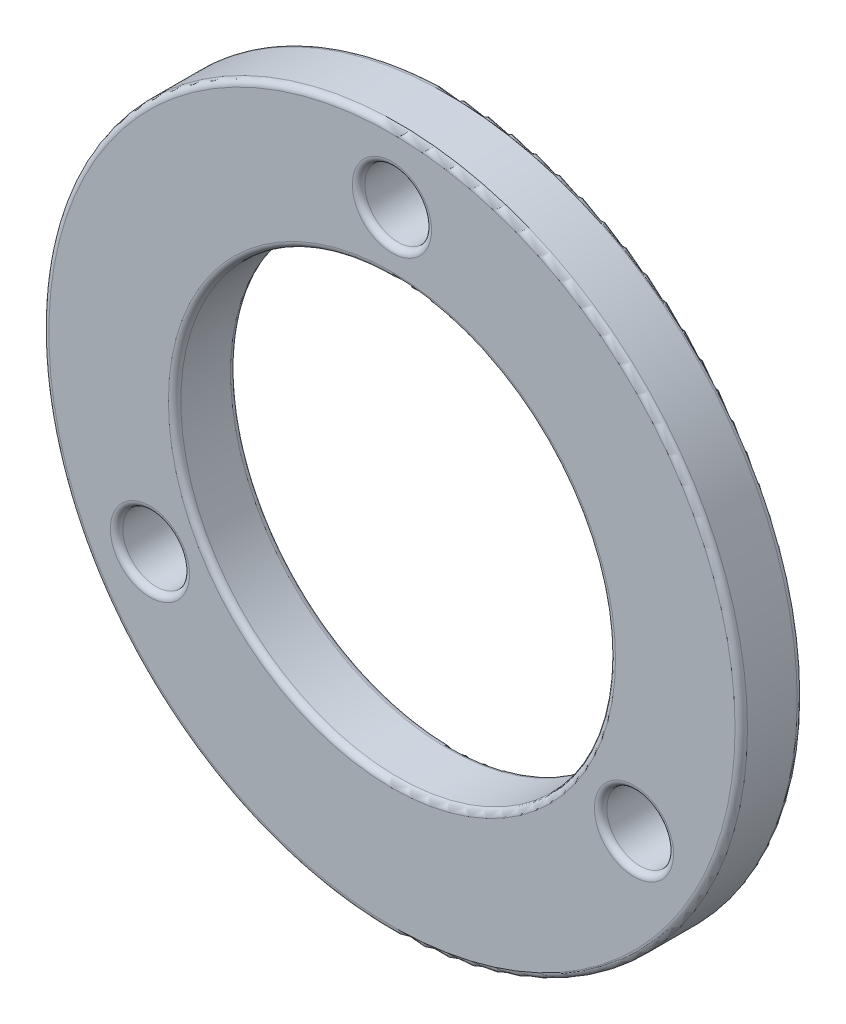
ISO-10303-21;
HEADER;
FILE_DESCRIPTION(('STEP AP214'),'2;1');
FILE_NAME('part.step','',(''),(''),'','','');
FILE_SCHEMA(('AUTOMOTIVE_DESIGN { 1 0 10303 214 1 1 1 1 }'));
ENDSEC;
DATA;
#1=APPLICATION_CONTEXT('core data for automotive mechanical design processes');
#2=APPLICATION_PROTOCOL_DEFINITION('international standard','automotive_design',2000,#1);
#3=PRODUCT_CONTEXT('',#1,'mechanical');
#4=PRODUCT('Part','Part','',(#3));
#5=PRODUCT_RELATED_PRODUCT_CATEGORY('part','',(#4));
#6=PRODUCT_DEFINITION_FORMATION('','',#4);
#7=PRODUCT_DEFINITION_CONTEXT('part definition',#1,'design');
#8=PRODUCT_DEFINITION('design','',#6,#7);
#9=PRODUCT_DEFINITION_SHAPE('','',#8);
#10=(LENGTH_UNIT() NAMED_UNIT(*) SI_UNIT(.MILLI.,.METRE.));
#11=(NAMED_UNIT(*) PLANE_ANGLE_UNIT() SI_UNIT($,.RADIAN.));
#12=(NAMED_UNIT(*) SI_UNIT($,.STERADIAN.) SOLID_ANGLE_UNIT());
#13=UNCERTAINTY_MEASURE_WITH_UNIT(LENGTH_MEASURE(1.E-05),#10,'distance_accuracy_value','');
#14=(GEOMETRIC_REPRESENTATION_CONTEXT(3) GLOBAL_UNCERTAINTY_ASSIGNED_CONTEXT((#13)) GLOBAL_UNIT_ASSIGNED_CONTEXT((#10,
#11,#12)) REPRESENTATION_CONTEXT('',''));
#15=CARTESIAN_POINT('',(0.,0.,0.));
#16=DIRECTION('',(0.,0.,1.));
#17=DIRECTION('',(1.,0.,0.));
#18=AXIS2_PLACEMENT_3D('',#15,#16,#17);
#19=CARTESIAN_POINT('',(0.,0.,20.));
#20=DIRECTION('',(0.,0.,1.));
#21=DIRECTION('',(1.,0.,0.));
#22=AXIS2_PLACEMENT_3D('',#19,#20,#21);
#23=PLANE('',#22);
#24=CARTESIAN_POINT('',(0.,0.,20.));
#25=DIRECTION('',(0.,0.,1.));
#26=DIRECTION('',(1.,0.,0.));
#27=AXIS2_PLACEMENT_3D('',#24,#25,#26);
#28=CIRCLE('',#27,72.);
#29=CARTESIAN_POINT('',(72.,0.,20.));
#30=VERTEX_POINT('',#29);
#31=EDGE_CURVE('E75',#30,#30,#28,.F.);
#32=ORIENTED_EDGE('',*,*,#31,.T.);
#33=EDGE_LOOP('',(#32));
#34=FACE_BOUND('',#33,.T.);
#35=CARTESIAN_POINT('',(0.,0.,20.));
#36=DIRECTION('',(0.,0.,1.));
#37=DIRECTION('',(1.,0.,0.));
#38=AXIS2_PLACEMENT_3D('',#35,#36,#37);
#39=CIRCLE('',#38,110.5);
#40=CARTESIAN_POINT('',(110.5,0.,20.));
#41=VERTEX_POINT('',#40);
#42=EDGE_CURVE('E78',#41,#41,#39,.T.);
#43=ORIENTED_EDGE('',*,*,#42,.T.);
#44=EDGE_LOOP('',(#43));
#45=FACE_BOUND('',#44,.T.);
#46=CARTESIAN_POINT('',(-77.9422863405995,-45.,20.));
#47=DIRECTION('',(0.,0.,1.));
#48=DIRECTION('',(1.,0.,0.));
#49=AXIS2_PLACEMENT_3D('',#46,#47,#48);
#50=CIRCLE('',#49,12.75);
#51=CARTESIAN_POINT('',(-65.1922863405995,-45.,20.));
#52=VERTEX_POINT('',#51);
#53=EDGE_CURVE('E81',#52,#52,#50,.F.);
#54=ORIENTED_EDGE('',*,*,#53,.T.);
#55=EDGE_LOOP('',(#54));
#56=FACE_BOUND('',#55,.T.);
#57=CARTESIAN_POINT('',(0.,90.,20.));
#58=DIRECTION('',(0.,0.,1.));
#59=DIRECTION('',(1.,0.,0.));
#60=AXIS2_PLACEMENT_3D('',#57,#58,#59);
#61=CIRCLE('',#60,12.75);
#62=CARTESIAN_POINT('',(12.75,90.,20.));
#63=VERTEX_POINT('',#62);
#64=EDGE_CURVE('E84',#63,#63,#61,.F.);
#65=ORIENTED_EDGE('',*,*,#64,.T.);
#66=EDGE_LOOP('',(#65));
#67=FACE_BOUND('',#66,.T.);
#68=CARTESIAN_POINT('',(77.9422863405995,-45.,20.));
#69=DIRECTION('',(0.,0.,1.));
#70=DIRECTION('',(1.,0.,0.));
#71=AXIS2_PLACEMENT_3D('',#68,#69,#70);
#72=CIRCLE('',#71,12.75);
#73=CARTESIAN_POINT('',(90.6922863405995,-45.,20.));
#74=VERTEX_POINT('',#73);
#75=EDGE_CURVE('E87',#74,#74,#72,.F.);
#76=ORIENTED_EDGE('',*,*,#75,.T.);
#77=EDGE_LOOP('',(#76));
#78=FACE_BOUND('',#77,.T.);
#79=ADVANCED_FACE('F49',(#34,#45,#56,#67,#78),#23,.T.);
#80=CARTESIAN_POINT('',(0.,0.,0.));
#81=DIRECTION('',(0.,0.,1.));
#82=DIRECTION('',(1.,0.,0.));
#83=AXIS2_PLACEMENT_3D('',#80,#81,#82);
#84=PLANE('',#83);
#85=CARTESIAN_POINT('',(0.,0.,0.));
#86=DIRECTION('',(0.,0.,1.));
#87=DIRECTION('',(1.,0.,0.));
#88=AXIS2_PLACEMENT_3D('',#85,#86,#87);
#89=CIRCLE('',#88,72.);
#90=CARTESIAN_POINT('',(72.,0.,0.));
#91=VERTEX_POINT('',#90);
#92=EDGE_CURVE('E102',#91,#91,#89,.T.);
#93=ORIENTED_EDGE('',*,*,#92,.T.);
#94=EDGE_LOOP('',(#93));
#95=FACE_BOUND('',#94,.T.);
#96=CARTESIAN_POINT('',(0.,0.,0.));
#97=DIRECTION('',(0.,0.,1.));
#98=DIRECTION('',(1.,0.,0.));
#99=AXIS2_PLACEMENT_3D('',#96,#97,#98);
#100=CIRCLE('',#99,110.5);
#101=CARTESIAN_POINT('',(110.5,0.,0.));
#102=VERTEX_POINT('',#101);
#103=EDGE_CURVE('E105',#102,#102,#100,.F.);
#104=ORIENTED_EDGE('',*,*,#103,.T.);
#105=EDGE_LOOP('',(#104));
#106=FACE_BOUND('',#105,.T.);
#107=CARTESIAN_POINT('',(77.9422863405995,-45.,0.));
#108=DIRECTION('',(0.,0.,1.));
#109=DIRECTION('',(1.,0.,0.));
#110=AXIS2_PLACEMENT_3D('',#107,#108,#109);
#111=CIRCLE('',#110,12.75);
#112=CARTESIAN_POINT('',(90.6922863405995,-45.,0.));
#113=VERTEX_POINT('',#112);
#114=EDGE_CURVE('E108',#113,#113,#111,.T.);
#115=ORIENTED_EDGE('',*,*,#114,.T.);
#116=EDGE_LOOP('',(#115));
#117=FACE_BOUND('',#116,.T.);
#118=CARTESIAN_POINT('',(0.,90.,0.));
#119=DIRECTION('',(0.,0.,1.));
#120=DIRECTION('',(1.,0.,0.));
#121=AXIS2_PLACEMENT_3D('',#118,#119,#120);
#122=CIRCLE('',#121,12.75);
#123=CARTESIAN_POINT('',(12.75,90.,0.));
#124=VERTEX_POINT('',#123);
#125=EDGE_CURVE('E111',#124,#124,#122,.T.);
#126=ORIENTED_EDGE('',*,*,#125,.T.);
#127=EDGE_LOOP('',(#126));
#128=FACE_BOUND('',#127,.T.);
#129=CARTESIAN_POINT('',(-77.9422863405995,-45.,0.));
#130=DIRECTION('',(0.,0.,1.));
#131=DIRECTION('',(1.,0.,0.));
#132=AXIS2_PLACEMENT_3D('',#129,#130,#131);
#133=CIRCLE('',#132,12.75);
#134=CARTESIAN_POINT('',(-65.1922863405995,-45.,0.));
#135=VERTEX_POINT('',#134);
#136=EDGE_CURVE('E114',#135,#135,#133,.T.);
#137=ORIENTED_EDGE('',*,*,#136,.T.);
#138=EDGE_LOOP('',(#137));
#139=FACE_BOUND('',#138,.T.);
#140=ADVANCED_FACE('F118',(#95,#106,#117,#128,#139),#84,.F.);
#141=CARTESIAN_POINT('',(0.,0.,20.));
#142=DIRECTION('',(0.,0.,-1.));
#143=DIRECTION('',(-1.,0.,0.));
#144=AXIS2_PLACEMENT_3D('',#141,#142,#143);
#145=CYLINDRICAL_SURFACE('',#144,112.5);
#146=CARTESIAN_POINT('',(0.,0.,2.));
#147=DIRECTION('',(0.,0.,1.));
#148=DIRECTION('',(1.,0.,0.));
#149=AXIS2_PLACEMENT_3D('',#146,#147,#148);
#150=CIRCLE('',#149,112.5);
#151=CARTESIAN_POINT('',(112.5,0.,2.));
#152=VERTEX_POINT('',#151);
#153=EDGE_CURVE('E90',#152,#152,#150,.T.);
#154=ORIENTED_EDGE('',*,*,#153,.T.);
#155=EDGE_LOOP('',(#154));
#156=FACE_BOUND('',#155,.T.);
#157=CARTESIAN_POINT('',(0.,0.,18.));
#158=DIRECTION('',(0.,0.,1.));
#159=DIRECTION('',(1.,0.,0.));
#160=AXIS2_PLACEMENT_3D('',#157,#158,#159);
#161=CIRCLE('',#160,112.5);
#162=CARTESIAN_POINT('',(112.5,0.,18.));
#163=VERTEX_POINT('',#162);
#164=EDGE_CURVE('E93',#163,#163,#161,.F.);
#165=ORIENTED_EDGE('',*,*,#164,.T.);
#166=EDGE_LOOP('',(#165));
#167=FACE_BOUND('',#166,.T.);
#168=ADVANCED_FACE('F142',(#156,#167),#145,.T.);
#169=CARTESIAN_POINT('',(0.,90.,20.));
#170=DIRECTION('',(0.,0.,-1.));
#171=DIRECTION('',(-1.,0.,0.));
#172=AXIS2_PLACEMENT_3D('',#169,#170,#171);
#173=CYLINDRICAL_SURFACE('',#172,10.75);
#174=CARTESIAN_POINT('',(0.,90.,2.));
#175=DIRECTION('',(0.,0.,1.));
#176=DIRECTION('',(1.,0.,0.));
#177=AXIS2_PLACEMENT_3D('',#174,#175,#176);
#178=CIRCLE('',#177,10.75);
#179=CARTESIAN_POINT('',(10.75,90.,2.));
#180=VERTEX_POINT('',#179);
#181=EDGE_CURVE('E60',#180,#180,#178,.F.);
#182=ORIENTED_EDGE('',*,*,#181,.T.);
#183=EDGE_LOOP('',(#182));
#184=FACE_BOUND('',#183,.T.);
#185=CARTESIAN_POINT('',(0.,90.,18.));
#186=DIRECTION('',(0.,0.,1.));
#187=DIRECTION('',(1.,0.,0.));
#188=AXIS2_PLACEMENT_3D('',#185,#186,#187);
#189=CIRCLE('',#188,10.75);
#190=CARTESIAN_POINT('',(10.75,90.,18.));
#191=VERTEX_POINT('',#190);
#192=EDGE_CURVE('E64',#191,#191,#189,.T.);
#193=ORIENTED_EDGE('',*,*,#192,.T.);
#194=EDGE_LOOP('',(#193));
#195=FACE_BOUND('',#194,.T.);
#196=ADVANCED_FACE('F147',(#184,#195),#173,.F.);
#197=CARTESIAN_POINT('',(77.9422863405995,-45.,20.));
#198=DIRECTION('',(0.,0.,-1.));
#199=DIRECTION('',(-1.,0.,0.));
#200=AXIS2_PLACEMENT_3D('',#197,#198,#199);
#201=CYLINDRICAL_SURFACE('',#200,10.75);
#202=CARTESIAN_POINT('',(77.9422863405995,-45.,2.));
#203=DIRECTION('',(0.,0.,1.));
#204=DIRECTION('',(1.,0.,0.));
#205=AXIS2_PLACEMENT_3D('',#202,#203,#204);
#206=CIRCLE('',#205,10.75);
#207=CARTESIAN_POINT('',(88.6922863405995,-45.,2.));
#208=VERTEX_POINT('',#207);
#209=EDGE_CURVE('E69',#208,#208,#206,.F.);
#210=ORIENTED_EDGE('',*,*,#209,.T.);
#211=EDGE_LOOP('',(#210));
#212=FACE_BOUND('',#211,.T.);
#213=CARTESIAN_POINT('',(77.9422863405995,-45.,18.));
#214=DIRECTION('',(0.,0.,1.));
#215=DIRECTION('',(1.,0.,0.));
#216=AXIS2_PLACEMENT_3D('',#213,#214,#215);
#217=CIRCLE('',#216,10.75);
#218=CARTESIAN_POINT('',(88.6922863405995,-45.,18.));
#219=VERTEX_POINT('',#218);
#220=EDGE_CURVE('E72',#219,#219,#217,.T.);
#221=ORIENTED_EDGE('',*,*,#220,.T.);
#222=EDGE_LOOP('',(#221));
#223=FACE_BOUND('',#222,.T.);
#224=ADVANCED_FACE('F182',(#212,#223),#201,.F.);
#225=CARTESIAN_POINT('',(-77.9422863405995,-45.,20.));
#226=DIRECTION('',(0.,0.,-1.));
#227=DIRECTION('',(-1.,0.,0.));
#228=AXIS2_PLACEMENT_3D('',#225,#226,#227);
#229=CYLINDRICAL_SURFACE('',#228,10.75);
#230=CARTESIAN_POINT('',(-77.9422863405995,-45.,2.));
#231=DIRECTION('',(0.,0.,1.));
#232=DIRECTION('',(1.,0.,0.));
#233=AXIS2_PLACEMENT_3D('',#230,#231,#232);
#234=CIRCLE('',#233,10.75);
#235=CARTESIAN_POINT('',(-67.1922863405995,-45.,2.));
#236=VERTEX_POINT('',#235);
#237=EDGE_CURVE('E12',#236,#236,#234,.F.);
#238=ORIENTED_EDGE('',*,*,#237,.T.);
#239=EDGE_LOOP('',(#238));
#240=FACE_BOUND('',#239,.T.);
#241=CARTESIAN_POINT('',(-77.9422863405995,-45.,18.));
#242=DIRECTION('',(0.,0.,1.));
#243=DIRECTION('',(1.,0.,0.));
#244=AXIS2_PLACEMENT_3D('',#241,#242,#243);
#245=CIRCLE('',#244,10.75);
#246=CARTESIAN_POINT('',(-67.1922863405995,-45.,18.));
#247=VERTEX_POINT('',#246);
#248=EDGE_CURVE('E56',#247,#247,#245,.T.);
#249=ORIENTED_EDGE('',*,*,#248,.T.);
#250=EDGE_LOOP('',(#249));
#251=FACE_BOUND('',#250,.T.);
#252=ADVANCED_FACE('F185',(#240,#251),#229,.F.);
#253=CARTESIAN_POINT('',(0.,0.,20.));
#254=DIRECTION('',(0.,0.,-1.));
#255=DIRECTION('',(-1.,0.,0.));
#256=AXIS2_PLACEMENT_3D('',#253,#254,#255);
#257=CYLINDRICAL_SURFACE('',#256,70.);
#258=CARTESIAN_POINT('',(0.,0.,2.));
#259=DIRECTION('',(0.,0.,1.));
#260=DIRECTION('',(1.,0.,0.));
#261=AXIS2_PLACEMENT_3D('',#258,#259,#260);
#262=CIRCLE('',#261,70.);
#263=CARTESIAN_POINT('',(70.,0.,2.));
#264=VERTEX_POINT('',#263);
#265=EDGE_CURVE('E96',#264,#264,#262,.F.);
#266=ORIENTED_EDGE('',*,*,#265,.T.);
#267=EDGE_LOOP('',(#266));
#268=FACE_BOUND('',#267,.T.);
#269=CARTESIAN_POINT('',(0.,0.,18.));
#270=DIRECTION('',(0.,0.,1.));
#271=DIRECTION('',(1.,0.,0.));
#272=AXIS2_PLACEMENT_3D('',#269,#270,#271);
#273=CIRCLE('',#272,70.);
#274=CARTESIAN_POINT('',(70.,0.,18.));
#275=VERTEX_POINT('',#274);
#276=EDGE_CURVE('E99',#275,#275,#273,.T.);
#277=ORIENTED_EDGE('',*,*,#276,.T.);
#278=EDGE_LOOP('',(#277));
#279=FACE_BOUND('',#278,.T.);
#280=ADVANCED_FACE('F157',(#268,#279),#257,.F.);
#281=CARTESIAN_POINT('',(0.,0.,2.));
#282=DIRECTION('',(0.,0.,1.));
#283=DIRECTION('',(1.,0.,0.));
#284=AXIS2_PLACEMENT_3D('',#281,#282,#283);
#285=TOROIDAL_SURFACE('',#284,72.,2.);
#286=ORIENTED_EDGE('',*,*,#265,.F.);
#287=EDGE_LOOP('',(#286));
#288=FACE_BOUND('',#287,.T.);
#289=ORIENTED_EDGE('',*,*,#92,.F.);
#290=EDGE_LOOP('',(#289));
#291=FACE_BOUND('',#290,.T.);
#292=ADVANCED_FACE('F153',(#288,#291),#285,.T.);
#293=CARTESIAN_POINT('',(0.,0.,2.));
#294=DIRECTION('',(0.,0.,1.));
#295=DIRECTION('',(1.,0.,0.));
#296=AXIS2_PLACEMENT_3D('',#293,#294,#295);
#297=TOROIDAL_SURFACE('',#296,110.5,2.);
#298=ORIENTED_EDGE('',*,*,#103,.F.);
#299=EDGE_LOOP('',(#298));
#300=FACE_BOUND('',#299,.T.);
#301=ORIENTED_EDGE('',*,*,#153,.F.);
#302=EDGE_LOOP('',(#301));
#303=FACE_BOUND('',#302,.T.);
#304=ADVANCED_FACE('F156',(#300,#303),#297,.T.);
#305=CARTESIAN_POINT('',(0.,0.,18.));
#306=DIRECTION('',(0.,0.,1.));
#307=DIRECTION('',(1.,0.,0.));
#308=AXIS2_PLACEMENT_3D('',#305,#306,#307);
#309=TOROIDAL_SURFACE('',#308,72.,2.);
#310=ORIENTED_EDGE('',*,*,#31,.F.);
#311=EDGE_LOOP('',(#310));
#312=FACE_BOUND('',#311,.T.);
#313=ORIENTED_EDGE('',*,*,#276,.F.);
#314=EDGE_LOOP('',(#313));
#315=FACE_BOUND('',#314,.T.);
#316=ADVANCED_FACE('F161',(#312,#315),#309,.T.);
#317=CARTESIAN_POINT('',(0.,0.,18.));
#318=DIRECTION('',(0.,0.,1.));
#319=DIRECTION('',(1.,0.,0.));
#320=AXIS2_PLACEMENT_3D('',#317,#318,#319);
#321=TOROIDAL_SURFACE('',#320,110.5,2.);
#322=ORIENTED_EDGE('',*,*,#164,.F.);
#323=EDGE_LOOP('',(#322));
#324=FACE_BOUND('',#323,.T.);
#325=ORIENTED_EDGE('',*,*,#42,.F.);
#326=EDGE_LOOP('',(#325));
#327=FACE_BOUND('',#326,.T.);
#328=ADVANCED_FACE('F165',(#324,#327),#321,.T.);
#329=CARTESIAN_POINT('',(77.9422863405995,-45.,2.));
#330=DIRECTION('',(0.,0.,1.));
#331=DIRECTION('',(1.,0.,0.));
#332=AXIS2_PLACEMENT_3D('',#329,#330,#331);
#333=TOROIDAL_SURFACE('',#332,12.75,2.);
#334=ORIENTED_EDGE('',*,*,#209,.F.);
#335=EDGE_LOOP('',(#334));
#336=FACE_BOUND('',#335,.T.);
#337=ORIENTED_EDGE('',*,*,#114,.F.);
#338=EDGE_LOOP('',(#337));
#339=FACE_BOUND('',#338,.T.);
#340=ADVANCED_FACE('F133',(#336,#339),#333,.T.);
#341=CARTESIAN_POINT('',(0.,90.,2.));
#342=DIRECTION('',(0.,0.,1.));
#343=DIRECTION('',(1.,0.,0.));
#344=AXIS2_PLACEMENT_3D('',#341,#342,#343);
#345=TOROIDAL_SURFACE('',#344,12.75,2.);
#346=ORIENTED_EDGE('',*,*,#181,.F.);
#347=EDGE_LOOP('',(#346));
#348=FACE_BOUND('',#347,.T.);
#349=ORIENTED_EDGE('',*,*,#125,.F.);
#350=EDGE_LOOP('',(#349));
#351=FACE_BOUND('',#350,.T.);
#352=ADVANCED_FACE('F123',(#348,#351),#345,.T.);
#353=CARTESIAN_POINT('',(-77.9422863405995,-45.,2.));
#354=DIRECTION('',(0.,0.,1.));
#355=DIRECTION('',(1.,0.,0.));
#356=AXIS2_PLACEMENT_3D('',#353,#354,#355);
#357=TOROIDAL_SURFACE('',#356,12.75,2.);
#358=ORIENTED_EDGE('',*,*,#237,.F.);
#359=EDGE_LOOP('',(#358));
#360=FACE_BOUND('',#359,.T.);
#361=ORIENTED_EDGE('',*,*,#136,.F.);
#362=EDGE_LOOP('',(#361));
#363=FACE_BOUND('',#362,.T.);
#364=ADVANCED_FACE('F120',(#360,#363),#357,.T.);
#365=CARTESIAN_POINT('',(-77.9422863405995,-45.,18.));
#366=DIRECTION('',(0.,0.,1.));
#367=DIRECTION('',(1.,0.,0.));
#368=AXIS2_PLACEMENT_3D('',#365,#366,#367);
#369=TOROIDAL_SURFACE('',#368,12.75,2.);
#370=ORIENTED_EDGE('',*,*,#53,.F.);
#371=EDGE_LOOP('',(#370));
#372=FACE_BOUND('',#371,.T.);
#373=ORIENTED_EDGE('',*,*,#248,.F.);
#374=EDGE_LOOP('',(#373));
#375=FACE_BOUND('',#374,.T.);
#376=ADVANCED_FACE('F122',(#372,#375),#369,.T.);
#377=CARTESIAN_POINT('',(0.,90.,18.));
#378=DIRECTION('',(0.,0.,1.));
#379=DIRECTION('',(1.,0.,0.));
#380=AXIS2_PLACEMENT_3D('',#377,#378,#379);
#381=TOROIDAL_SURFACE('',#380,12.75,2.);
#382=ORIENTED_EDGE('',*,*,#64,.F.);
#383=EDGE_LOOP('',(#382));
#384=FACE_BOUND('',#383,.T.);
#385=ORIENTED_EDGE('',*,*,#192,.F.);
#386=EDGE_LOOP('',(#385));
#387=FACE_BOUND('',#386,.T.);
#388=ADVANCED_FACE('F130',(#384,#387),#381,.T.);
#389=CARTESIAN_POINT('',(77.9422863405995,-45.,18.));
#390=DIRECTION('',(0.,0.,1.));
#391=DIRECTION('',(1.,0.,0.));
#392=AXIS2_PLACEMENT_3D('',#389,#390,#391);
#393=TOROIDAL_SURFACE('',#392,12.75,2.);
#394=ORIENTED_EDGE('',*,*,#75,.F.);
#395=EDGE_LOOP('',(#394));
#396=FACE_BOUND('',#395,.T.);
#397=ORIENTED_EDGE('',*,*,#220,.F.);
#398=EDGE_LOOP('',(#397));
#399=FACE_BOUND('',#398,.T.);
#400=ADVANCED_FACE('F51',(#396,#399),#393,.T.);
#401=CLOSED_SHELL('',(#79,#140,#168,#196,#224,#252,#280,#292,#304,#316,#328,#340,#352,#364,#376,
#388,#400));
#402=MANIFOLD_SOLID_BREP('B2',#401);
#403=ADVANCED_BREP_SHAPE_REPRESENTATION('',(#18,#402),#14);
#404=SHAPE_DEFINITION_REPRESENTATION(#9,#403);
ENDSEC;
END-ISO-10303-21;
